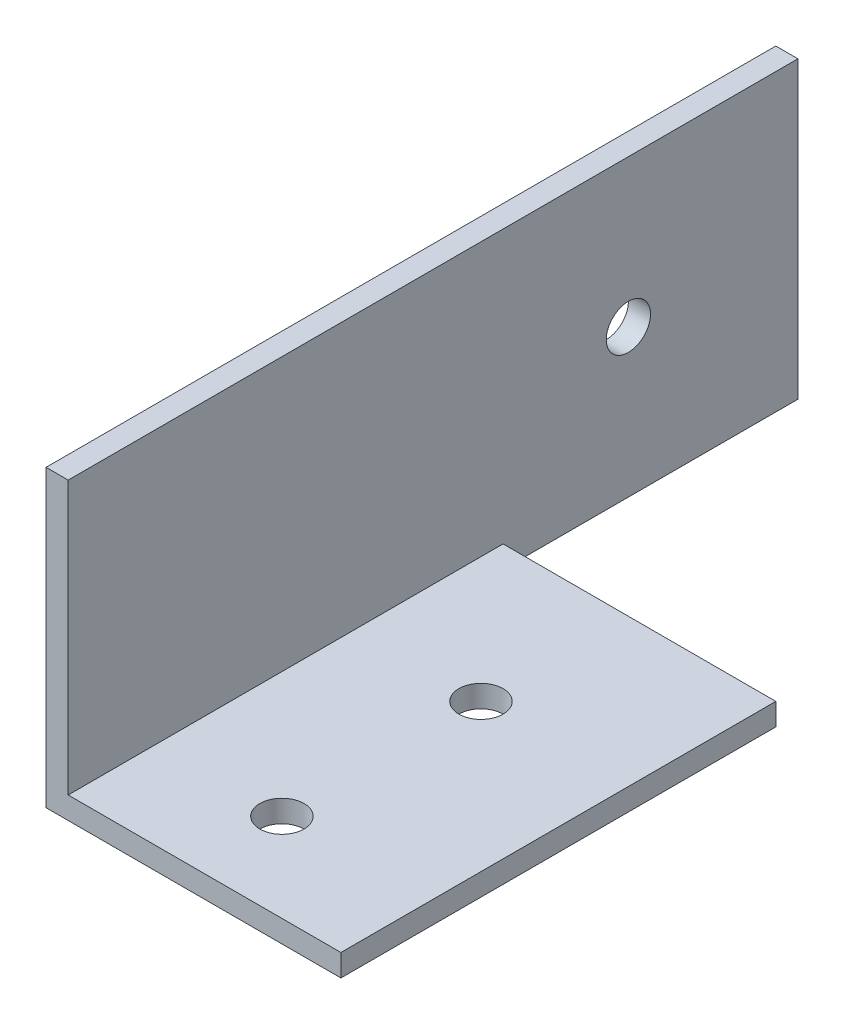
ISO-10303-21;
HEADER;
FILE_DESCRIPTION(('STEP AP214'),'2;1');
FILE_NAME('part.step','',(''),(''),'','','');
FILE_SCHEMA(('AUTOMOTIVE_DESIGN { 1 0 10303 214 1 1 1 1 }'));
ENDSEC;
DATA;
#1=APPLICATION_CONTEXT('core data for automotive mechanical design processes');
#2=APPLICATION_PROTOCOL_DEFINITION('international standard','automotive_design',2000,#1);
#3=PRODUCT_CONTEXT('',#1,'mechanical');
#4=PRODUCT('Part','Part','',(#3));
#5=PRODUCT_RELATED_PRODUCT_CATEGORY('part','',(#4));
#6=PRODUCT_DEFINITION_FORMATION('','',#4);
#7=PRODUCT_DEFINITION_CONTEXT('part definition',#1,'design');
#8=PRODUCT_DEFINITION('design','',#6,#7);
#9=PRODUCT_DEFINITION_SHAPE('','',#8);
#10=(LENGTH_UNIT() NAMED_UNIT(*) SI_UNIT(.MILLI.,.METRE.));
#11=(NAMED_UNIT(*) PLANE_ANGLE_UNIT() SI_UNIT($,.RADIAN.));
#12=(NAMED_UNIT(*) SI_UNIT($,.STERADIAN.) SOLID_ANGLE_UNIT());
#13=UNCERTAINTY_MEASURE_WITH_UNIT(LENGTH_MEASURE(1.E-05),#10,'distance_accuracy_value','');
#14=(GEOMETRIC_REPRESENTATION_CONTEXT(3) GLOBAL_UNCERTAINTY_ASSIGNED_CONTEXT((#13)) GLOBAL_UNIT_ASSIGNED_CONTEXT((#10,
#11,#12)) REPRESENTATION_CONTEXT('',''));
#15=CARTESIAN_POINT('',(0.,0.,0.));
#16=DIRECTION('',(0.,0.,1.));
#17=DIRECTION('',(1.,0.,0.));
#18=AXIS2_PLACEMENT_3D('',#15,#16,#17);
#19=CARTESIAN_POINT('',(-23.4313705903621,6.59147368421053,49.5));
#20=DIRECTION('',(0.,-1.,0.));
#21=DIRECTION('',(0.,0.,-1.));
#22=AXIS2_PLACEMENT_3D('',#19,#20,#21);
#23=PLANE('',#22);
#24=DIRECTION('',(-1.,0.,0.));
#25=VECTOR('',#24,1.);
#26=CARTESIAN_POINT('',(-23.4313705903621,6.59147368421053,0.));
#27=LINE('',#26,#25);
#28=CARTESIAN_POINT('',(-23.4313705903621,6.59147368421053,0.));
#29=VERTEX_POINT('',#28);
#30=CARTESIAN_POINT('',(-24.9313705903621,6.59147368421053,0.));
#31=VERTEX_POINT('',#30);
#32=EDGE_CURVE('E116',#29,#31,#27,.T.);
#33=ORIENTED_EDGE('',*,*,#32,.T.);
#34=DIRECTION('',(0.,0.,-1.));
#35=VECTOR('',#34,1.);
#36=CARTESIAN_POINT('',(-24.9313705903621,6.59147368421053,49.5));
#37=LINE('',#36,#35);
#38=CARTESIAN_POINT('',(-24.9313705903621,6.59147368421053,49.5));
#39=VERTEX_POINT('',#38);
#40=EDGE_CURVE('E11',#39,#31,#37,.T.);
#41=ORIENTED_EDGE('',*,*,#40,.F.);
#42=DIRECTION('',(-1.,0.,0.));
#43=VECTOR('',#42,1.);
#44=CARTESIAN_POINT('',(-23.4313705903621,6.59147368421053,49.5));
#45=LINE('',#44,#43);
#46=CARTESIAN_POINT('',(-23.4313705903621,6.59147368421053,49.5));
#47=VERTEX_POINT('',#46);
#48=EDGE_CURVE('E126',#47,#39,#45,.T.);
#49=ORIENTED_EDGE('',*,*,#48,.F.);
#50=DIRECTION('',(0.,0.,-1.));
#51=VECTOR('',#50,1.);
#52=CARTESIAN_POINT('',(-23.4313705903621,6.59147368421053,49.5));
#53=LINE('',#52,#51);
#54=EDGE_CURVE('E112',#47,#29,#53,.T.);
#55=ORIENTED_EDGE('',*,*,#54,.T.);
#56=EDGE_LOOP('',(#33,#41,#49,#55));
#57=FACE_BOUND('',#56,.T.);
#58=ADVANCED_FACE('F31',(#57),#23,.F.);
#59=CARTESIAN_POINT('',(-24.9313705903621,6.59147368421053,49.5));
#60=DIRECTION('',(1.,0.,0.));
#61=DIRECTION('',(0.,0.,-1.));
#62=AXIS2_PLACEMENT_3D('',#59,#60,#61);
#63=PLANE('',#62);
#64=CARTESIAN_POINT('',(-24.9313705903621,-3.40852631578947,11.5));
#65=DIRECTION('',(1.,0.,0.));
#66=DIRECTION('',(0.,0.,-1.));
#67=AXIS2_PLACEMENT_3D('',#64,#65,#66);
#68=CIRCLE('',#67,1.5);
#69=CARTESIAN_POINT('',(-24.9313705903621,-3.40852631578947,10.));
#70=VERTEX_POINT('',#69);
#71=EDGE_CURVE('E268',#70,#70,#68,.T.);
#72=ORIENTED_EDGE('',*,*,#71,.T.);
#73=EDGE_LOOP('',(#72));
#74=FACE_BOUND('',#73,.T.);
#75=DIRECTION('',(0.,-1.,0.));
#76=VECTOR('',#75,1.);
#77=CARTESIAN_POINT('',(-24.9313705903621,6.59147368421053,0.));
#78=LINE('',#77,#76);
#79=CARTESIAN_POINT('',(-24.9313705903621,-13.4085263157895,0.));
#80=VERTEX_POINT('',#79);
#81=EDGE_CURVE('E119',#31,#80,#78,.T.);
#82=ORIENTED_EDGE('',*,*,#81,.T.);
#83=DIRECTION('',(0.,0.,-1.));
#84=VECTOR('',#83,1.);
#85=CARTESIAN_POINT('',(-24.9313705903621,-13.4085263157895,49.5));
#86=LINE('',#85,#84);
#87=CARTESIAN_POINT('',(-24.9313705903621,-13.4085263157895,49.5));
#88=VERTEX_POINT('',#87);
#89=EDGE_CURVE('E38',#88,#80,#86,.T.);
#90=ORIENTED_EDGE('',*,*,#89,.F.);
#91=DIRECTION('',(0.,-1.,0.));
#92=VECTOR('',#91,1.);
#93=CARTESIAN_POINT('',(-24.9313705903621,6.59147368421053,49.5));
#94=LINE('',#93,#92);
#95=EDGE_CURVE('E76',#39,#88,#94,.T.);
#96=ORIENTED_EDGE('',*,*,#95,.F.);
#97=ORIENTED_EDGE('',*,*,#40,.T.);
#98=EDGE_LOOP('',(#82,#90,#96,#97));
#99=FACE_BOUND('',#98,.T.);
#100=ADVANCED_FACE('F135',(#74,#99),#63,.F.);
#101=CARTESIAN_POINT('',(-24.9313705903621,-13.4085263157895,49.5));
#102=DIRECTION('',(0.,1.,0.));
#103=DIRECTION('',(0.,0.,1.));
#104=AXIS2_PLACEMENT_3D('',#101,#102,#103);
#105=PLANE('',#104);
#106=CARTESIAN_POINT('',(-14.9313705903621,-13.4085263157895,30.));
#107=DIRECTION('',(0.,1.,0.));
#108=DIRECTION('',(0.,0.,1.));
#109=AXIS2_PLACEMENT_3D('',#106,#107,#108);
#110=CIRCLE('',#109,1.5);
#111=CARTESIAN_POINT('',(-14.9313705903621,-13.4085263157895,31.5));
#112=VERTEX_POINT('',#111);
#113=EDGE_CURVE('E158',#112,#112,#110,.T.);
#114=ORIENTED_EDGE('',*,*,#113,.T.);
#115=EDGE_LOOP('',(#114));
#116=FACE_BOUND('',#115,.T.);
#117=CARTESIAN_POINT('',(-14.9313705903621,-13.4085263157895,43.5));
#118=DIRECTION('',(0.,1.,0.));
#119=DIRECTION('',(0.,0.,1.));
#120=AXIS2_PLACEMENT_3D('',#117,#118,#119);
#121=CIRCLE('',#120,1.5);
#122=CARTESIAN_POINT('',(-14.9313705903621,-13.4085263157895,45.));
#123=VERTEX_POINT('',#122);
#124=EDGE_CURVE('E120',#123,#123,#121,.T.);
#125=ORIENTED_EDGE('',*,*,#124,.T.);
#126=EDGE_LOOP('',(#125));
#127=FACE_BOUND('',#126,.T.);
#128=DIRECTION('',(0.,0.,1.));
#129=VECTOR('',#128,1.);
#130=CARTESIAN_POINT('',(-23.4313705903621,-13.4085263157895,49.5));
#131=LINE('',#130,#129);
#132=CARTESIAN_POINT('',(-23.4313705903621,-13.4085263157895,0.));
#133=VERTEX_POINT('',#132);
#134=CARTESIAN_POINT('',(-23.4313705903621,-13.4085263157895,20.));
#135=VERTEX_POINT('',#134);
#136=EDGE_CURVE('E153',#133,#135,#131,.T.);
#137=ORIENTED_EDGE('',*,*,#136,.T.);
#138=DIRECTION('',(1.,0.,0.));
#139=VECTOR('',#138,1.);
#140=CARTESIAN_POINT('',(-24.9313705903621,-13.4085263157895,20.));
#141=LINE('',#140,#139);
#142=CARTESIAN_POINT('',(-4.93137059036207,-13.4085263157895,20.));
#143=VERTEX_POINT('',#142);
#144=EDGE_CURVE('E150',#135,#143,#141,.T.);
#145=ORIENTED_EDGE('',*,*,#144,.T.);
#146=DIRECTION('',(0.,0.,-1.));
#147=VECTOR('',#146,1.);
#148=CARTESIAN_POINT('',(-4.93137059036207,-13.4085263157895,49.5));
#149=LINE('',#148,#147);
#150=CARTESIAN_POINT('',(-4.93137059036207,-13.4085263157895,49.5));
#151=VERTEX_POINT('',#150);
#152=EDGE_CURVE('E106',#151,#143,#149,.T.);
#153=ORIENTED_EDGE('',*,*,#152,.F.);
#154=DIRECTION('',(1.,0.,0.));
#155=VECTOR('',#154,1.);
#156=CARTESIAN_POINT('',(-24.9313705903621,-13.4085263157895,49.5));
#157=LINE('',#156,#155);
#158=EDGE_CURVE('E92',#88,#151,#157,.T.);
#159=ORIENTED_EDGE('',*,*,#158,.F.);
#160=ORIENTED_EDGE('',*,*,#89,.T.);
#161=DIRECTION('',(1.,0.,0.));
#162=VECTOR('',#161,1.);
#163=CARTESIAN_POINT('',(-24.9313705903621,-13.4085263157895,0.));
#164=LINE('',#163,#162);
#165=EDGE_CURVE('E122',#80,#133,#164,.T.);
#166=ORIENTED_EDGE('',*,*,#165,.T.);
#167=EDGE_LOOP('',(#137,#145,#153,#159,#160,#166));
#168=FACE_BOUND('',#167,.T.);
#169=ADVANCED_FACE('F132',(#116,#127,#168),#105,.F.);
#170=CARTESIAN_POINT('',(-4.93137059036207,-13.4085263157895,49.5));
#171=DIRECTION('',(-1.,0.,0.));
#172=DIRECTION('',(0.,0.,1.));
#173=AXIS2_PLACEMENT_3D('',#170,#171,#172);
#174=PLANE('',#173);
#175=ORIENTED_EDGE('',*,*,#152,.T.);
#176=DIRECTION('',(0.,1.,0.));
#177=VECTOR('',#176,1.);
#178=CARTESIAN_POINT('',(-4.93137059036204,-111.908526315789,20.));
#179=LINE('',#178,#177);
#180=CARTESIAN_POINT('',(-4.93137059036207,-11.9085263157895,20.));
#181=VERTEX_POINT('',#180);
#182=EDGE_CURVE('E103',#143,#181,#179,.T.);
#183=ORIENTED_EDGE('',*,*,#182,.T.);
#184=DIRECTION('',(0.,0.,-1.));
#185=VECTOR('',#184,1.);
#186=CARTESIAN_POINT('',(-4.93137059036207,-11.9085263157895,49.5));
#187=LINE('',#186,#185);
#188=CARTESIAN_POINT('',(-4.93137059036207,-11.9085263157895,49.5));
#189=VERTEX_POINT('',#188);
#190=EDGE_CURVE('E99',#189,#181,#187,.T.);
#191=ORIENTED_EDGE('',*,*,#190,.F.);
#192=DIRECTION('',(0.,1.,0.));
#193=VECTOR('',#192,1.);
#194=CARTESIAN_POINT('',(-4.93137059036207,-13.4085263157895,49.5));
#195=LINE('',#194,#193);
#196=EDGE_CURVE('E85',#151,#189,#195,.T.);
#197=ORIENTED_EDGE('',*,*,#196,.F.);
#198=EDGE_LOOP('',(#175,#183,#191,#197));
#199=FACE_BOUND('',#198,.T.);
#200=ADVANCED_FACE('F100',(#199),#174,.F.);
#201=CARTESIAN_POINT('',(-4.93137059036207,-11.9085263157895,49.5));
#202=DIRECTION('',(0.,-1.,0.));
#203=DIRECTION('',(1.,0.,0.));
#204=AXIS2_PLACEMENT_3D('',#201,#202,#203);
#205=PLANE('',#204);
#206=CARTESIAN_POINT('',(-14.9313705903621,-11.9085263157895,30.));
#207=DIRECTION('',(0.,1.,0.));
#208=DIRECTION('',(-1.,0.,0.));
#209=AXIS2_PLACEMENT_3D('',#206,#207,#208);
#210=CIRCLE('',#209,1.5);
#211=CARTESIAN_POINT('',(-16.4313705903621,-11.9085263157895,30.));
#212=VERTEX_POINT('',#211);
#213=EDGE_CURVE('E155',#212,#212,#210,.T.);
#214=ORIENTED_EDGE('',*,*,#213,.F.);
#215=EDGE_LOOP('',(#214));
#216=FACE_BOUND('',#215,.T.);
#217=CARTESIAN_POINT('',(-14.9313705903621,-11.9085263157895,43.5));
#218=DIRECTION('',(0.,1.,0.));
#219=DIRECTION('',(-1.,0.,0.));
#220=AXIS2_PLACEMENT_3D('',#217,#218,#219);
#221=CIRCLE('',#220,1.5);
#222=CARTESIAN_POINT('',(-16.4313705903621,-11.9085263157895,43.5));
#223=VERTEX_POINT('',#222);
#224=EDGE_CURVE('E165',#223,#223,#221,.T.);
#225=ORIENTED_EDGE('',*,*,#224,.F.);
#226=EDGE_LOOP('',(#225));
#227=FACE_BOUND('',#226,.T.);
#228=ORIENTED_EDGE('',*,*,#190,.T.);
#229=DIRECTION('',(1.,0.,0.));
#230=VECTOR('',#229,1.);
#231=CARTESIAN_POINT('',(-4.93137059036207,-11.9085263157895,20.));
#232=LINE('',#231,#230);
#233=CARTESIAN_POINT('',(-23.4313705903621,-11.9085263157895,20.));
#234=VERTEX_POINT('',#233);
#235=EDGE_CURVE('E152',#234,#181,#232,.T.);
#236=ORIENTED_EDGE('',*,*,#235,.F.);
#237=DIRECTION('',(0.,0.,-1.));
#238=VECTOR('',#237,1.);
#239=CARTESIAN_POINT('',(-23.4313705903621,-11.9085263157895,49.5));
#240=LINE('',#239,#238);
#241=CARTESIAN_POINT('',(-23.4313705903621,-11.9085263157895,49.5));
#242=VERTEX_POINT('',#241);
#243=EDGE_CURVE('E107',#242,#234,#240,.T.);
#244=ORIENTED_EDGE('',*,*,#243,.F.);
#245=DIRECTION('',(-1.,0.,0.));
#246=VECTOR('',#245,1.);
#247=CARTESIAN_POINT('',(-4.93137059036207,-11.9085263157895,49.5));
#248=LINE('',#247,#246);
#249=EDGE_CURVE('E89',#189,#242,#248,.T.);
#250=ORIENTED_EDGE('',*,*,#249,.F.);
#251=EDGE_LOOP('',(#228,#236,#244,#250));
#252=FACE_BOUND('',#251,.T.);
#253=ADVANCED_FACE('F109',(#216,#227,#252),#205,.F.);
#254=CARTESIAN_POINT('',(-23.4313705903621,-11.9085263157895,49.5));
#255=DIRECTION('',(-1.,0.,0.));
#256=DIRECTION('',(0.,0.,1.));
#257=AXIS2_PLACEMENT_3D('',#254,#255,#256);
#258=PLANE('',#257);
#259=CARTESIAN_POINT('',(-23.4313705903621,-3.40852631578947,11.5));
#260=DIRECTION('',(1.,0.,0.));
#261=DIRECTION('',(0.,0.,-1.));
#262=AXIS2_PLACEMENT_3D('',#259,#260,#261);
#263=CIRCLE('',#262,1.5);
#264=CARTESIAN_POINT('',(-23.4313705903621,-3.40852631578947,10.));
#265=VERTEX_POINT('',#264);
#266=EDGE_CURVE('E266',#265,#265,#263,.T.);
#267=ORIENTED_EDGE('',*,*,#266,.F.);
#268=EDGE_LOOP('',(#267));
#269=FACE_BOUND('',#268,.T.);
#270=DIRECTION('',(0.,1.,0.));
#271=VECTOR('',#270,1.);
#272=CARTESIAN_POINT('',(-23.4313705903621,-11.9085263157895,0.));
#273=LINE('',#272,#271);
#274=EDGE_CURVE('E45',#133,#29,#273,.T.);
#275=ORIENTED_EDGE('',*,*,#274,.T.);
#276=ORIENTED_EDGE('',*,*,#54,.F.);
#277=DIRECTION('',(0.,1.,0.));
#278=VECTOR('',#277,1.);
#279=CARTESIAN_POINT('',(-23.4313705903621,-11.9085263157895,49.5));
#280=LINE('',#279,#278);
#281=EDGE_CURVE('E54',#242,#47,#280,.T.);
#282=ORIENTED_EDGE('',*,*,#281,.F.);
#283=ORIENTED_EDGE('',*,*,#243,.T.);
#284=DIRECTION('',(0.,1.,0.));
#285=VECTOR('',#284,1.);
#286=CARTESIAN_POINT('',(-23.431370590362,-111.908526315789,20.));
#287=LINE('',#286,#285);
#288=EDGE_CURVE('E143',#135,#234,#287,.T.);
#289=ORIENTED_EDGE('',*,*,#288,.F.);
#290=ORIENTED_EDGE('',*,*,#136,.F.);
#291=EDGE_LOOP('',(#275,#276,#282,#283,#289,#290));
#292=FACE_BOUND('',#291,.T.);
#293=ADVANCED_FACE('F138',(#269,#292),#258,.F.);
#294=CARTESIAN_POINT('',(-24.9313705903621,6.59147368421053,49.5));
#295=DIRECTION('',(0.,0.,1.));
#296=DIRECTION('',(1.,0.,0.));
#297=AXIS2_PLACEMENT_3D('',#294,#295,#296);
#298=PLANE('',#297);
#299=ORIENTED_EDGE('',*,*,#48,.T.);
#300=ORIENTED_EDGE('',*,*,#95,.T.);
#301=ORIENTED_EDGE('',*,*,#158,.T.);
#302=ORIENTED_EDGE('',*,*,#196,.T.);
#303=ORIENTED_EDGE('',*,*,#249,.T.);
#304=ORIENTED_EDGE('',*,*,#281,.T.);
#305=EDGE_LOOP('',(#299,#300,#301,#302,#303,#304));
#306=FACE_BOUND('',#305,.T.);
#307=ADVANCED_FACE('F87',(#306),#298,.T.);
#308=CARTESIAN_POINT('',(-24.9313705903621,6.59147368421053,0.));
#309=DIRECTION('',(0.,0.,1.));
#310=DIRECTION('',(1.,0.,0.));
#311=AXIS2_PLACEMENT_3D('',#308,#309,#310);
#312=PLANE('',#311);
#313=ORIENTED_EDGE('',*,*,#274,.F.);
#314=ORIENTED_EDGE('',*,*,#165,.F.);
#315=ORIENTED_EDGE('',*,*,#81,.F.);
#316=ORIENTED_EDGE('',*,*,#32,.F.);
#317=EDGE_LOOP('',(#313,#314,#315,#316));
#318=FACE_BOUND('',#317,.T.);
#319=ADVANCED_FACE('F133',(#318),#312,.F.);
#320=CARTESIAN_POINT('',(-14.931370590362,-111.908526315789,43.5));
#321=DIRECTION('',(0.,1.,0.));
#322=DIRECTION('',(-1.,0.,0.));
#323=AXIS2_PLACEMENT_3D('',#320,#321,#322);
#324=CYLINDRICAL_SURFACE('',#323,1.5);
#325=ORIENTED_EDGE('',*,*,#224,.T.);
#326=EDGE_LOOP('',(#325));
#327=FACE_BOUND('',#326,.T.);
#328=ORIENTED_EDGE('',*,*,#124,.F.);
#329=EDGE_LOOP('',(#328));
#330=FACE_BOUND('',#329,.T.);
#331=ADVANCED_FACE('F174',(#327,#330),#324,.F.);
#332=CARTESIAN_POINT('',(-14.931370590362,-111.908526315789,30.));
#333=DIRECTION('',(0.,1.,0.));
#334=DIRECTION('',(-1.,0.,0.));
#335=AXIS2_PLACEMENT_3D('',#332,#333,#334);
#336=CYLINDRICAL_SURFACE('',#335,1.5);
#337=ORIENTED_EDGE('',*,*,#213,.T.);
#338=EDGE_LOOP('',(#337));
#339=FACE_BOUND('',#338,.T.);
#340=ORIENTED_EDGE('',*,*,#113,.F.);
#341=EDGE_LOOP('',(#340));
#342=FACE_BOUND('',#341,.T.);
#343=ADVANCED_FACE('F176',(#339,#342),#336,.F.);
#344=CARTESIAN_POINT('',(-4.93137059036204,-111.908526315789,20.));
#345=DIRECTION('',(0.,0.,1.));
#346=DIRECTION('',(1.,0.,0.));
#347=AXIS2_PLACEMENT_3D('',#344,#345,#346);
#348=PLANE('',#347);
#349=ORIENTED_EDGE('',*,*,#288,.T.);
#350=ORIENTED_EDGE('',*,*,#235,.T.);
#351=ORIENTED_EDGE('',*,*,#182,.F.);
#352=ORIENTED_EDGE('',*,*,#144,.F.);
#353=EDGE_LOOP('',(#349,#350,#351,#352));
#354=FACE_BOUND('',#353,.T.);
#355=ADVANCED_FACE('F151',(#354),#348,.F.);
#356=CARTESIAN_POINT('',(-123.431370590362,-3.40852631578947,11.5));
#357=DIRECTION('',(1.,0.,0.));
#358=DIRECTION('',(0.,0.,-1.));
#359=AXIS2_PLACEMENT_3D('',#356,#357,#358);
#360=CYLINDRICAL_SURFACE('',#359,1.5);
#361=ORIENTED_EDGE('',*,*,#266,.T.);
#362=EDGE_LOOP('',(#361));
#363=FACE_BOUND('',#362,.T.);
#364=ORIENTED_EDGE('',*,*,#71,.F.);
#365=EDGE_LOOP('',(#364));
#366=FACE_BOUND('',#365,.T.);
#367=ADVANCED_FACE('F239',(#363,#366),#360,.F.);
#368=CLOSED_SHELL('',(#58,#100,#169,#200,#253,#293,#307,#319,#331,#343,#355,#367));
#369=MANIFOLD_SOLID_BREP('B2',#368);
#370=ADVANCED_BREP_SHAPE_REPRESENTATION('',(#18,#369),#14);
#371=SHAPE_DEFINITION_REPRESENTATION(#9,#370);
ENDSEC;
END-ISO-10303-21;
